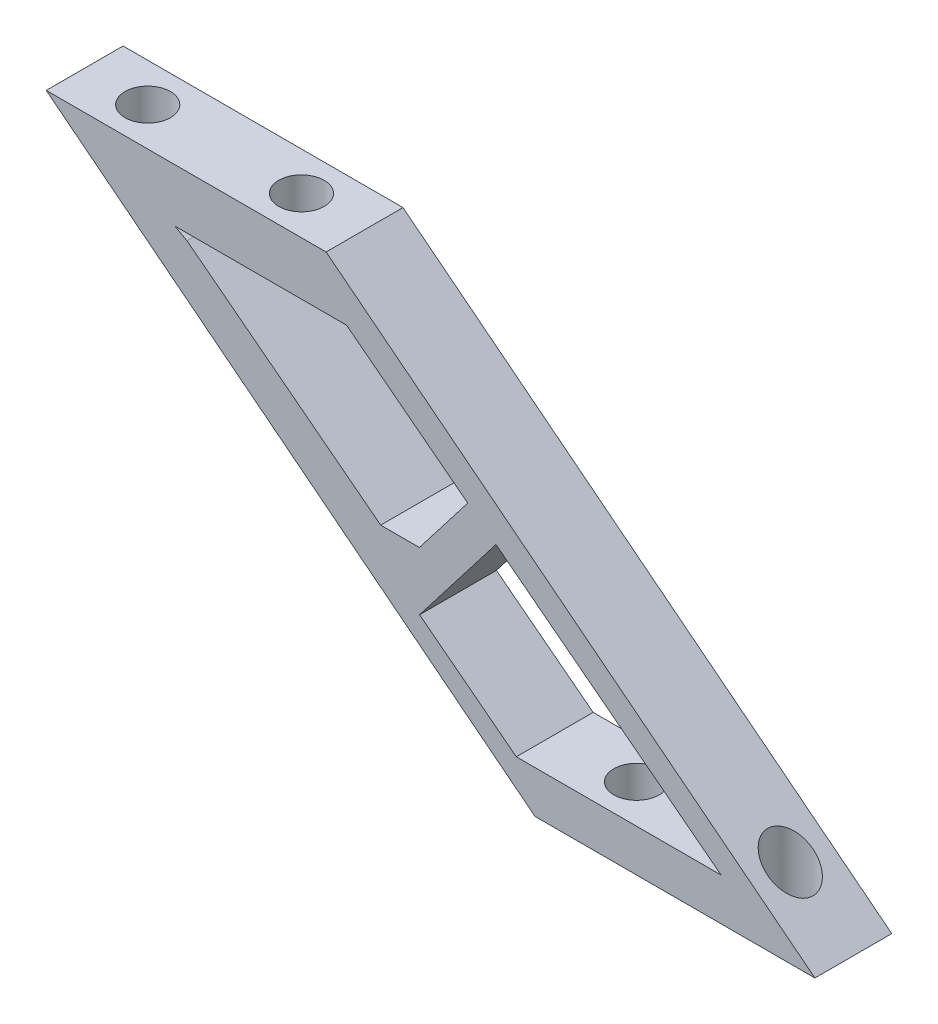
ISO-10303-21;
HEADER;
FILE_DESCRIPTION(('STEP AP214'),'2;1');
FILE_NAME('part.step','',(''),(''),'','','');
FILE_SCHEMA(('AUTOMOTIVE_DESIGN { 1 0 10303 214 1 1 1 1 }'));
ENDSEC;
DATA;
#1=APPLICATION_CONTEXT('core data for automotive mechanical design processes');
#2=APPLICATION_PROTOCOL_DEFINITION('international standard','automotive_design',2000,#1);
#3=PRODUCT_CONTEXT('',#1,'mechanical');
#4=PRODUCT('Part','Part','',(#3));
#5=PRODUCT_RELATED_PRODUCT_CATEGORY('part','',(#4));
#6=PRODUCT_DEFINITION_FORMATION('','',#4);
#7=PRODUCT_DEFINITION_CONTEXT('part definition',#1,'design');
#8=PRODUCT_DEFINITION('design','',#6,#7);
#9=PRODUCT_DEFINITION_SHAPE('','',#8);
#10=(LENGTH_UNIT() NAMED_UNIT(*) SI_UNIT(.MILLI.,.METRE.));
#11=(NAMED_UNIT(*) PLANE_ANGLE_UNIT() SI_UNIT($,.RADIAN.));
#12=(NAMED_UNIT(*) SI_UNIT($,.STERADIAN.) SOLID_ANGLE_UNIT());
#13=UNCERTAINTY_MEASURE_WITH_UNIT(LENGTH_MEASURE(1.E-05),#10,'distance_accuracy_value','');
#14=(GEOMETRIC_REPRESENTATION_CONTEXT(3) GLOBAL_UNCERTAINTY_ASSIGNED_CONTEXT((#13)) GLOBAL_UNIT_ASSIGNED_CONTEXT((#10,
#11,#12)) REPRESENTATION_CONTEXT('',''));
#15=CARTESIAN_POINT('',(0.,0.,0.));
#16=DIRECTION('',(0.,0.,1.));
#17=DIRECTION('',(1.,0.,0.));
#18=AXIS2_PLACEMENT_3D('',#15,#16,#17);
#19=CARTESIAN_POINT('',(0.,0.,5.08));
#20=DIRECTION('',(0.,0.,-1.));
#21=DIRECTION('',(-1.,0.,0.));
#22=AXIS2_PLACEMENT_3D('',#19,#20,#21);
#23=PLANE('',#22);
#24=DIRECTION('',(0.877534902704471,-0.479512767854469,0.));
#25=VECTOR('',#24,1.);
#26=CARTESIAN_POINT('',(-14.1614739616725,12.9484208044287,5.08));
#27=LINE('',#26,#25);
#28=CARTESIAN_POINT('',(-14.1614739616725,12.9484208044287,5.08));
#29=VERTEX_POINT('',#28);
#30=CARTESIAN_POINT('',(-13.3566851393728,12.5086587909408,5.08));
#31=VERTEX_POINT('',#30);
#32=EDGE_CURVE('E193',#29,#31,#27,.T.);
#33=ORIENTED_EDGE('',*,*,#32,.F.);
#34=DIRECTION('',(-1.,0.,0.));
#35=VECTOR('',#34,1.);
#36=CARTESIAN_POINT('',(-2.806028736932,12.9484208044287,5.08));
#37=LINE('',#36,#35);
#38=CARTESIAN_POINT('',(-2.806028736932,12.9484208044287,5.08));
#39=VERTEX_POINT('',#38);
#40=EDGE_CURVE('E210',#39,#29,#37,.T.);
#41=ORIENTED_EDGE('',*,*,#40,.F.);
#42=DIRECTION('',(-0.791782255563472,0.610803454291821,0.));
#43=VECTOR('',#42,1.);
#44=CARTESIAN_POINT('',(5.20104717489364,6.7715336724489,5.08));
#45=LINE('',#44,#43);
#46=CARTESIAN_POINT('',(5.20104717489364,6.7715336724489,5.08));
#47=VERTEX_POINT('',#46);
#48=EDGE_CURVE('E206',#47,#39,#45,.T.);
#49=ORIENTED_EDGE('',*,*,#48,.F.);
#50=DIRECTION('',(0.610803454291821,0.791782255563472,0.));
#51=VECTOR('',#50,1.);
#52=CARTESIAN_POINT('',(2.00746510452962,2.63170506271777,5.08));
#53=LINE('',#52,#51);
#54=CARTESIAN_POINT('',(2.00746510452962,2.63170506271777,5.08));
#55=VERTEX_POINT('',#54);
#56=EDGE_CURVE('E203',#55,#47,#53,.T.);
#57=ORIENTED_EDGE('',*,*,#56,.F.);
#58=DIRECTION('',(1.,0.,0.));
#59=VECTOR('',#58,1.);
#60=CARTESIAN_POINT('',(-0.553226602787449,2.63170506271777,5.08));
#61=LINE('',#60,#59);
#62=CARTESIAN_POINT('',(-0.553226602787449,2.63170506271777,5.08));
#63=VERTEX_POINT('',#62);
#64=EDGE_CURVE('E200',#63,#55,#61,.T.);
#65=ORIENTED_EDGE('',*,*,#64,.F.);
#66=DIRECTION('',(0.791782255563472,-0.610803454291821,0.));
#67=VECTOR('',#66,1.);
#68=CARTESIAN_POINT('',(-13.3566851393728,12.5086587909408,5.08));
#69=LINE('',#68,#67);
#70=EDGE_CURVE('E196',#31,#63,#69,.T.);
#71=ORIENTED_EDGE('',*,*,#70,.F.);
#72=EDGE_LOOP('',(#33,#41,#49,#57,#65,#71));
#73=FACE_BOUND('',#72,.T.);
#74=DIRECTION('',(0.786094086668964,-0.61810685718902,0.));
#75=VECTOR('',#74,1.);
#76=CARTESIAN_POINT('',(9.64668989547041,-8.93867595818816,5.08));
#77=LINE('',#76,#75);
#78=CARTESIAN_POINT('',(-22.6564459930313,16.4613240418118,5.08));
#79=VERTEX_POINT('',#78);
#80=CARTESIAN_POINT('',(9.64668989547041,-8.93867595818816,5.08));
#81=VERTEX_POINT('',#80);
#82=EDGE_CURVE('E256',#79,#81,#77,.T.);
#83=ORIENTED_EDGE('',*,*,#82,.T.);
#84=DIRECTION('',(1.,0.,0.));
#85=VECTOR('',#84,1.);
#86=CARTESIAN_POINT('',(28.1435540069687,-8.93867595818815,5.08));
#87=LINE('',#86,#85);
#88=CARTESIAN_POINT('',(28.1435540069687,-8.93867595818815,5.08));
#89=VERTEX_POINT('',#88);
#90=EDGE_CURVE('E260',#81,#89,#87,.T.);
#91=ORIENTED_EDGE('',*,*,#90,.T.);
#92=DIRECTION('',(-0.786094086668964,0.61810685718902,0.));
#93=VECTOR('',#92,1.);
#94=CARTESIAN_POINT('',(-4.15958188153309,16.4613240418118,5.08));
#95=LINE('',#94,#93);
#96=CARTESIAN_POINT('',(-4.15958188153309,16.4613240418118,5.08));
#97=VERTEX_POINT('',#96);
#98=EDGE_CURVE('E264',#89,#97,#95,.T.);
#99=ORIENTED_EDGE('',*,*,#98,.T.);
#100=DIRECTION('',(-1.,0.,0.));
#101=VECTOR('',#100,1.);
#102=CARTESIAN_POINT('',(-22.6564459930313,16.4613240418118,5.08));
#103=LINE('',#102,#101);
#104=EDGE_CURVE('E267',#97,#79,#103,.T.);
#105=ORIENTED_EDGE('',*,*,#104,.T.);
#106=EDGE_LOOP('',(#83,#91,#99,#105));
#107=FACE_BOUND('',#106,.T.);
#108=DIRECTION('',(1.,0.,0.));
#109=VECTOR('',#108,1.);
#110=CARTESIAN_POINT('',(8.40936408639423,-6.14480474340157,5.08));
#111=LINE('',#110,#109);
#112=CARTESIAN_POINT('',(8.40936408639423,-6.14480474340157,5.08));
#113=VERTEX_POINT('',#112);
#114=CARTESIAN_POINT('',(21.9444488250702,-6.14480474340157,5.08));
#115=VERTEX_POINT('',#114);
#116=EDGE_CURVE('E143',#113,#115,#111,.T.);
#117=ORIENTED_EDGE('',*,*,#116,.F.);
#118=DIRECTION('',(0.791782255563472,-0.610803454291821,0.));
#119=VECTOR('',#118,1.);
#120=CARTESIAN_POINT('',(2.01749969112943,-1.2139379241973,5.08));
#121=LINE('',#120,#119);
#122=CARTESIAN_POINT('',(2.01749969112943,-1.2139379241973,5.08));
#123=VERTEX_POINT('',#122);
#124=EDGE_CURVE('E169',#123,#113,#121,.T.);
#125=ORIENTED_EDGE('',*,*,#124,.F.);
#126=DIRECTION('',(-0.610803454291821,-0.791782255563472,0.));
#127=VECTOR('',#126,1.);
#128=CARTESIAN_POINT('',(7.06718074255971,5.33194492024936,5.08));
#129=LINE('',#128,#127);
#130=CARTESIAN_POINT('',(7.06718074255971,5.33194492024936,5.08));
#131=VERTEX_POINT('',#130);
#132=EDGE_CURVE('E165',#131,#123,#129,.T.);
#133=ORIENTED_EDGE('',*,*,#132,.F.);
#134=DIRECTION('',(-0.791782255563472,0.610803454291821,0.));
#135=VECTOR('',#134,1.);
#136=CARTESIAN_POINT('',(21.9444488250702,-6.14480474340157,5.08));
#137=LINE('',#136,#135);
#138=EDGE_CURVE('E152',#115,#131,#137,.T.);
#139=ORIENTED_EDGE('',*,*,#138,.F.);
#140=EDGE_LOOP('',(#117,#125,#133,#139));
#141=FACE_BOUND('',#140,.T.);
#142=ADVANCED_FACE('F39',(#73,#107,#141),#23,.F.);
#143=CARTESIAN_POINT('',(0.,0.,0.));
#144=DIRECTION('',(0.,0.,-1.));
#145=DIRECTION('',(-1.,0.,0.));
#146=AXIS2_PLACEMENT_3D('',#143,#144,#145);
#147=PLANE('',#146);
#148=DIRECTION('',(0.786094086668964,-0.61810685718902,0.));
#149=VECTOR('',#148,1.);
#150=CARTESIAN_POINT('',(9.64668989547041,-8.93867595818816,0.));
#151=LINE('',#150,#149);
#152=CARTESIAN_POINT('',(-22.6564459930313,16.4613240418118,0.));
#153=VERTEX_POINT('',#152);
#154=CARTESIAN_POINT('',(9.64668989547041,-8.93867595818816,0.));
#155=VERTEX_POINT('',#154);
#156=EDGE_CURVE('E255',#153,#155,#151,.T.);
#157=ORIENTED_EDGE('',*,*,#156,.F.);
#158=DIRECTION('',(-1.,0.,0.));
#159=VECTOR('',#158,1.);
#160=CARTESIAN_POINT('',(-22.6564459930313,16.4613240418118,0.));
#161=LINE('',#160,#159);
#162=CARTESIAN_POINT('',(-4.15958188153309,16.4613240418118,0.));
#163=VERTEX_POINT('',#162);
#164=EDGE_CURVE('E261',#163,#153,#161,.T.);
#165=ORIENTED_EDGE('',*,*,#164,.F.);
#166=DIRECTION('',(-0.786094086668964,0.61810685718902,0.));
#167=VECTOR('',#166,1.);
#168=CARTESIAN_POINT('',(-4.15958188153309,16.4613240418118,0.));
#169=LINE('',#168,#167);
#170=CARTESIAN_POINT('',(28.1435540069687,-8.93867595818815,0.));
#171=VERTEX_POINT('',#170);
#172=EDGE_CURVE('E277',#171,#163,#169,.T.);
#173=ORIENTED_EDGE('',*,*,#172,.F.);
#174=DIRECTION('',(1.,0.,0.));
#175=VECTOR('',#174,1.);
#176=CARTESIAN_POINT('',(28.1435540069687,-8.93867595818815,0.));
#177=LINE('',#176,#175);
#178=EDGE_CURVE('E274',#155,#171,#177,.T.);
#179=ORIENTED_EDGE('',*,*,#178,.F.);
#180=EDGE_LOOP('',(#157,#165,#173,#179));
#181=FACE_BOUND('',#180,.T.);
#182=DIRECTION('',(-1.,0.,0.));
#183=VECTOR('',#182,1.);
#184=CARTESIAN_POINT('',(-2.806028736932,12.9484208044287,0.));
#185=LINE('',#184,#183);
#186=CARTESIAN_POINT('',(-2.806028736932,12.9484208044287,0.));
#187=VERTEX_POINT('',#186);
#188=CARTESIAN_POINT('',(-14.1614739616725,12.9484208044287,0.));
#189=VERTEX_POINT('',#188);
#190=EDGE_CURVE('E197',#187,#189,#185,.T.);
#191=ORIENTED_EDGE('',*,*,#190,.T.);
#192=DIRECTION('',(0.877534902704471,-0.479512767854469,0.));
#193=VECTOR('',#192,1.);
#194=CARTESIAN_POINT('',(-14.1614739616725,12.9484208044287,0.));
#195=LINE('',#194,#193);
#196=CARTESIAN_POINT('',(-13.3566851393728,12.5086587909408,0.));
#197=VERTEX_POINT('',#196);
#198=EDGE_CURVE('E161',#189,#197,#195,.T.);
#199=ORIENTED_EDGE('',*,*,#198,.T.);
#200=DIRECTION('',(0.791782255563472,-0.610803454291821,0.));
#201=VECTOR('',#200,1.);
#202=CARTESIAN_POINT('',(-13.3566851393728,12.5086587909408,0.));
#203=LINE('',#202,#201);
#204=CARTESIAN_POINT('',(-0.553226602787449,2.63170506271777,0.));
#205=VERTEX_POINT('',#204);
#206=EDGE_CURVE('E217',#197,#205,#203,.T.);
#207=ORIENTED_EDGE('',*,*,#206,.T.);
#208=DIRECTION('',(1.,0.,0.));
#209=VECTOR('',#208,1.);
#210=CARTESIAN_POINT('',(-0.553226602787449,2.63170506271777,0.));
#211=LINE('',#210,#209);
#212=CARTESIAN_POINT('',(2.00746510452962,2.63170506271777,0.));
#213=VERTEX_POINT('',#212);
#214=EDGE_CURVE('E221',#205,#213,#211,.T.);
#215=ORIENTED_EDGE('',*,*,#214,.T.);
#216=DIRECTION('',(0.610803454291821,0.791782255563472,0.));
#217=VECTOR('',#216,1.);
#218=CARTESIAN_POINT('',(2.00746510452962,2.63170506271777,0.));
#219=LINE('',#218,#217);
#220=CARTESIAN_POINT('',(5.20104717489364,6.7715336724489,0.));
#221=VERTEX_POINT('',#220);
#222=EDGE_CURVE('E225',#213,#221,#219,.T.);
#223=ORIENTED_EDGE('',*,*,#222,.T.);
#224=DIRECTION('',(-0.791782255563472,0.610803454291821,0.));
#225=VECTOR('',#224,1.);
#226=CARTESIAN_POINT('',(5.20104717489364,6.7715336724489,0.));
#227=LINE('',#226,#225);
#228=EDGE_CURVE('E229',#221,#187,#227,.T.);
#229=ORIENTED_EDGE('',*,*,#228,.T.);
#230=EDGE_LOOP('',(#191,#199,#207,#215,#223,#229));
#231=FACE_BOUND('',#230,.T.);
#232=DIRECTION('',(0.791782255563472,-0.610803454291821,0.));
#233=VECTOR('',#232,1.);
#234=CARTESIAN_POINT('',(2.01749969112943,-1.2139379241973,0.));
#235=LINE('',#234,#233);
#236=CARTESIAN_POINT('',(2.01749969112943,-1.2139379241973,0.));
#237=VERTEX_POINT('',#236);
#238=CARTESIAN_POINT('',(8.40936408639423,-6.14480474340157,0.));
#239=VERTEX_POINT('',#238);
#240=EDGE_CURVE('E153',#237,#239,#235,.T.);
#241=ORIENTED_EDGE('',*,*,#240,.T.);
#242=DIRECTION('',(1.,0.,0.));
#243=VECTOR('',#242,1.);
#244=CARTESIAN_POINT('',(8.40936408639423,-6.14480474340157,0.));
#245=LINE('',#244,#243);
#246=CARTESIAN_POINT('',(21.9444488250702,-6.14480474340157,0.));
#247=VERTEX_POINT('',#246);
#248=EDGE_CURVE('E65',#239,#247,#245,.T.);
#249=ORIENTED_EDGE('',*,*,#248,.T.);
#250=DIRECTION('',(-0.791782255563472,0.610803454291821,0.));
#251=VECTOR('',#250,1.);
#252=CARTESIAN_POINT('',(21.9444488250702,-6.14480474340157,0.));
#253=LINE('',#252,#251);
#254=CARTESIAN_POINT('',(7.06718074255971,5.33194492024936,0.));
#255=VERTEX_POINT('',#254);
#256=EDGE_CURVE('E159',#247,#255,#253,.T.);
#257=ORIENTED_EDGE('',*,*,#256,.T.);
#258=DIRECTION('',(-0.610803454291821,-0.791782255563472,0.));
#259=VECTOR('',#258,1.);
#260=CARTESIAN_POINT('',(7.06718074255971,5.33194492024936,0.));
#261=LINE('',#260,#259);
#262=EDGE_CURVE('E180',#255,#237,#261,.T.);
#263=ORIENTED_EDGE('',*,*,#262,.T.);
#264=EDGE_LOOP('',(#241,#249,#257,#263));
#265=FACE_BOUND('',#264,.T.);
#266=ADVANCED_FACE('F342',(#181,#231,#265),#147,.T.);
#267=CARTESIAN_POINT('',(9.64668989547041,-8.93867595818816,5.08));
#268=DIRECTION('',(0.61810685718902,0.786094086668963,0.));
#269=DIRECTION('',(-0.786094086668964,0.61810685718902,0.));
#270=AXIS2_PLACEMENT_3D('',#267,#268,#269);
#271=PLANE('',#270);
#272=CARTESIAN_POINT('',(-18.4880139372822,13.1836802061954,2.54));
#273=DIRECTION('',(0.61810685718902,0.786094086668963,0.));
#274=DIRECTION('',(-0.786094086668964,0.61810685718902,0.));
#275=AXIS2_PLACEMENT_3D('',#272,#273,#274);
#276=ELLIPSE('',#275,1.90816853279762,1.5);
#277=CARTESIAN_POINT('',(-19.9880139372822,14.3631322609899,2.54));
#278=VERTEX_POINT('',#277);
#279=EDGE_CURVE('E177',#278,#278,#276,.T.);
#280=ORIENTED_EDGE('',*,*,#279,.T.);
#281=EDGE_LOOP('',(#280));
#282=FACE_BOUND('',#281,.T.);
#283=ORIENTED_EDGE('',*,*,#156,.T.);
#284=DIRECTION('',(0.,0.,-1.));
#285=VECTOR('',#284,1.);
#286=CARTESIAN_POINT('',(9.64668989547041,-8.93867595818816,5.08));
#287=LINE('',#286,#285);
#288=EDGE_CURVE('E11',#81,#155,#287,.T.);
#289=ORIENTED_EDGE('',*,*,#288,.F.);
#290=ORIENTED_EDGE('',*,*,#82,.F.);
#291=DIRECTION('',(0.,0.,-1.));
#292=VECTOR('',#291,1.);
#293=CARTESIAN_POINT('',(-22.6564459930313,16.4613240418118,5.08));
#294=LINE('',#293,#292);
#295=EDGE_CURVE('E270',#79,#153,#294,.T.);
#296=ORIENTED_EDGE('',*,*,#295,.T.);
#297=EDGE_LOOP('',(#283,#289,#290,#296));
#298=FACE_BOUND('',#297,.T.);
#299=ADVANCED_FACE('F41',(#282,#298),#271,.F.);
#300=CARTESIAN_POINT('',(28.1435540069687,-8.93867595818815,5.08));
#301=DIRECTION('',(0.,1.,0.));
#302=DIRECTION('',(-1.,0.,0.));
#303=AXIS2_PLACEMENT_3D('',#300,#301,#302);
#304=PLANE('',#303);
#305=CARTESIAN_POINT('',(23.9751219512195,-8.93867595818816,2.54));
#306=DIRECTION('',(0.,-1.,0.));
#307=DIRECTION('',(1.,0.,0.));
#308=AXIS2_PLACEMENT_3D('',#305,#306,#307);
#309=CIRCLE('',#308,1.5);
#310=CARTESIAN_POINT('',(25.4751219512195,-8.93867595818816,2.54));
#311=VERTEX_POINT('',#310);
#312=EDGE_CURVE('E299',#311,#311,#309,.T.);
#313=ORIENTED_EDGE('',*,*,#312,.F.);
#314=EDGE_LOOP('',(#313));
#315=FACE_BOUND('',#314,.T.);
#316=CARTESIAN_POINT('',(13.8151219512195,-8.93867595818816,2.54));
#317=DIRECTION('',(0.,-1.,0.));
#318=DIRECTION('',(1.,0.,0.));
#319=AXIS2_PLACEMENT_3D('',#316,#317,#318);
#320=CIRCLE('',#319,1.5);
#321=CARTESIAN_POINT('',(15.3151219512195,-8.93867595818816,2.54));
#322=VERTEX_POINT('',#321);
#323=EDGE_CURVE('E307',#322,#322,#320,.T.);
#324=ORIENTED_EDGE('',*,*,#323,.F.);
#325=EDGE_LOOP('',(#324));
#326=FACE_BOUND('',#325,.T.);
#327=ORIENTED_EDGE('',*,*,#178,.T.);
#328=DIRECTION('',(0.,0.,-1.));
#329=VECTOR('',#328,1.);
#330=CARTESIAN_POINT('',(28.1435540069687,-8.93867595818815,5.08));
#331=LINE('',#330,#329);
#332=EDGE_CURVE('E49',#89,#171,#331,.T.);
#333=ORIENTED_EDGE('',*,*,#332,.F.);
#334=ORIENTED_EDGE('',*,*,#90,.F.);
#335=ORIENTED_EDGE('',*,*,#288,.T.);
#336=EDGE_LOOP('',(#327,#333,#334,#335));
#337=FACE_BOUND('',#336,.T.);
#338=ADVANCED_FACE('F362',(#315,#326,#337),#304,.F.);
#339=CARTESIAN_POINT('',(-4.15958188153309,16.4613240418118,5.08));
#340=DIRECTION('',(-0.61810685718902,-0.786094086668963,0.));
#341=DIRECTION('',(0.786094086668963,-0.61810685718902,0.));
#342=AXIS2_PLACEMENT_3D('',#339,#340,#341);
#343=PLANE('',#342);
#344=CARTESIAN_POINT('',(23.9751219512195,-5.66103212257173,2.54));
#345=DIRECTION('',(-0.61810685718902,-0.786094086668963,0.));
#346=DIRECTION('',(0.786094086668963,-0.61810685718902,0.));
#347=AXIS2_PLACEMENT_3D('',#344,#345,#346);
#348=ELLIPSE('',#347,1.90816853279762,1.5);
#349=CARTESIAN_POINT('',(25.4751219512195,-6.84048417736625,2.54));
#350=VERTEX_POINT('',#349);
#351=EDGE_CURVE('E43',#350,#350,#348,.T.);
#352=ORIENTED_EDGE('',*,*,#351,.T.);
#353=EDGE_LOOP('',(#352));
#354=FACE_BOUND('',#353,.T.);
#355=ORIENTED_EDGE('',*,*,#172,.T.);
#356=DIRECTION('',(0.,0.,-1.));
#357=VECTOR('',#356,1.);
#358=CARTESIAN_POINT('',(-4.15958188153309,16.4613240418118,5.08));
#359=LINE('',#358,#357);
#360=EDGE_CURVE('E285',#97,#163,#359,.T.);
#361=ORIENTED_EDGE('',*,*,#360,.F.);
#362=ORIENTED_EDGE('',*,*,#98,.F.);
#363=ORIENTED_EDGE('',*,*,#332,.T.);
#364=EDGE_LOOP('',(#355,#361,#362,#363));
#365=FACE_BOUND('',#364,.T.);
#366=ADVANCED_FACE('F359',(#354,#365),#343,.F.);
#367=CARTESIAN_POINT('',(-22.6564459930313,16.4613240418118,5.08));
#368=DIRECTION('',(0.,-1.,0.));
#369=DIRECTION('',(0.,0.,-1.));
#370=AXIS2_PLACEMENT_3D('',#367,#368,#369);
#371=PLANE('',#370);
#372=CARTESIAN_POINT('',(-18.4880139372822,16.4613240418118,2.54));
#373=DIRECTION('',(0.,1.,0.));
#374=DIRECTION('',(0.,0.,1.));
#375=AXIS2_PLACEMENT_3D('',#372,#373,#374);
#376=CIRCLE('',#375,1.5);
#377=CARTESIAN_POINT('',(-18.4880139372822,16.4613240418118,4.04));
#378=VERTEX_POINT('',#377);
#379=EDGE_CURVE('E295',#378,#378,#376,.T.);
#380=ORIENTED_EDGE('',*,*,#379,.F.);
#381=EDGE_LOOP('',(#380));
#382=FACE_BOUND('',#381,.T.);
#383=CARTESIAN_POINT('',(-8.32801393728222,16.4613240418118,2.54));
#384=DIRECTION('',(0.,1.,0.));
#385=DIRECTION('',(0.,0.,1.));
#386=AXIS2_PLACEMENT_3D('',#383,#384,#385);
#387=CIRCLE('',#386,1.5);
#388=CARTESIAN_POINT('',(-8.32801393728222,16.4613240418118,4.04));
#389=VERTEX_POINT('',#388);
#390=EDGE_CURVE('E305',#389,#389,#387,.T.);
#391=ORIENTED_EDGE('',*,*,#390,.F.);
#392=EDGE_LOOP('',(#391));
#393=FACE_BOUND('',#392,.T.);
#394=ORIENTED_EDGE('',*,*,#164,.T.);
#395=ORIENTED_EDGE('',*,*,#295,.F.);
#396=ORIENTED_EDGE('',*,*,#104,.F.);
#397=ORIENTED_EDGE('',*,*,#360,.T.);
#398=EDGE_LOOP('',(#394,#395,#396,#397));
#399=FACE_BOUND('',#398,.T.);
#400=ADVANCED_FACE('F356',(#382,#393,#399),#371,.F.);
#401=CARTESIAN_POINT('',(-14.1614739616725,12.9484208044287,5.08));
#402=DIRECTION('',(0.479512767854469,0.877534902704471,0.));
#403=DIRECTION('',(-0.877534902704471,0.479512767854469,0.));
#404=AXIS2_PLACEMENT_3D('',#401,#402,#403);
#405=PLANE('',#404);
#406=ORIENTED_EDGE('',*,*,#198,.F.);
#407=DIRECTION('',(0.,0.,-1.));
#408=VECTOR('',#407,1.);
#409=CARTESIAN_POINT('',(-14.1614739616725,12.9484208044287,5.08));
#410=LINE('',#409,#408);
#411=EDGE_CURVE('E213',#29,#189,#410,.T.);
#412=ORIENTED_EDGE('',*,*,#411,.F.);
#413=ORIENTED_EDGE('',*,*,#32,.T.);
#414=DIRECTION('',(0.,0.,-1.));
#415=VECTOR('',#414,1.);
#416=CARTESIAN_POINT('',(-13.3566851393728,12.5086587909408,5.08));
#417=LINE('',#416,#415);
#418=EDGE_CURVE('E251',#31,#197,#417,.T.);
#419=ORIENTED_EDGE('',*,*,#418,.T.);
#420=EDGE_LOOP('',(#406,#412,#413,#419));
#421=FACE_BOUND('',#420,.T.);
#422=ADVANCED_FACE('F353',(#421),#405,.T.);
#423=CARTESIAN_POINT('',(-13.3566851393728,12.5086587909408,5.08));
#424=DIRECTION('',(0.610803454291821,0.791782255563472,0.));
#425=DIRECTION('',(-0.791782255563472,0.610803454291821,0.));
#426=AXIS2_PLACEMENT_3D('',#423,#424,#425);
#427=PLANE('',#426);
#428=ORIENTED_EDGE('',*,*,#206,.F.);
#429=ORIENTED_EDGE('',*,*,#418,.F.);
#430=ORIENTED_EDGE('',*,*,#70,.T.);
#431=DIRECTION('',(0.,0.,-1.));
#432=VECTOR('',#431,1.);
#433=CARTESIAN_POINT('',(-0.553226602787449,2.63170506271777,5.08));
#434=LINE('',#433,#432);
#435=EDGE_CURVE('E248',#63,#205,#434,.T.);
#436=ORIENTED_EDGE('',*,*,#435,.T.);
#437=EDGE_LOOP('',(#428,#429,#430,#436));
#438=FACE_BOUND('',#437,.T.);
#439=ADVANCED_FACE('F416',(#438),#427,.T.);
#440=CARTESIAN_POINT('',(-0.553226602787449,2.63170506271777,5.08));
#441=DIRECTION('',(0.,1.,0.));
#442=DIRECTION('',(0.,0.,1.));
#443=AXIS2_PLACEMENT_3D('',#440,#441,#442);
#444=PLANE('',#443);
#445=ORIENTED_EDGE('',*,*,#214,.F.);
#446=ORIENTED_EDGE('',*,*,#435,.F.);
#447=ORIENTED_EDGE('',*,*,#64,.T.);
#448=DIRECTION('',(0.,0.,-1.));
#449=VECTOR('',#448,1.);
#450=CARTESIAN_POINT('',(2.00746510452962,2.63170506271777,5.08));
#451=LINE('',#450,#449);
#452=EDGE_CURVE('E245',#55,#213,#451,.T.);
#453=ORIENTED_EDGE('',*,*,#452,.T.);
#454=EDGE_LOOP('',(#445,#446,#447,#453));
#455=FACE_BOUND('',#454,.T.);
#456=ADVANCED_FACE('F413',(#455),#444,.T.);
#457=CARTESIAN_POINT('',(2.00746510452962,2.63170506271777,5.08));
#458=DIRECTION('',(-0.791782255563472,0.610803454291821,0.));
#459=DIRECTION('',(-0.610803454291821,-0.791782255563472,0.));
#460=AXIS2_PLACEMENT_3D('',#457,#458,#459);
#461=PLANE('',#460);
#462=ORIENTED_EDGE('',*,*,#222,.F.);
#463=ORIENTED_EDGE('',*,*,#452,.F.);
#464=ORIENTED_EDGE('',*,*,#56,.T.);
#465=DIRECTION('',(0.,0.,-1.));
#466=VECTOR('',#465,1.);
#467=CARTESIAN_POINT('',(5.20104717489364,6.7715336724489,5.08));
#468=LINE('',#467,#466);
#469=EDGE_CURVE('E242',#47,#221,#468,.T.);
#470=ORIENTED_EDGE('',*,*,#469,.T.);
#471=EDGE_LOOP('',(#462,#463,#464,#470));
#472=FACE_BOUND('',#471,.T.);
#473=ADVANCED_FACE('F409',(#472),#461,.T.);
#474=CARTESIAN_POINT('',(5.20104717489364,6.7715336724489,5.08));
#475=DIRECTION('',(-0.610803454291821,-0.791782255563472,0.));
#476=DIRECTION('',(0.791782255563472,-0.610803454291821,0.));
#477=AXIS2_PLACEMENT_3D('',#474,#475,#476);
#478=PLANE('',#477);
#479=ORIENTED_EDGE('',*,*,#228,.F.);
#480=ORIENTED_EDGE('',*,*,#469,.F.);
#481=ORIENTED_EDGE('',*,*,#48,.T.);
#482=DIRECTION('',(0.,0.,-1.));
#483=VECTOR('',#482,1.);
#484=CARTESIAN_POINT('',(-2.806028736932,12.9484208044287,5.08));
#485=LINE('',#484,#483);
#486=EDGE_CURVE('E239',#39,#187,#485,.T.);
#487=ORIENTED_EDGE('',*,*,#486,.T.);
#488=EDGE_LOOP('',(#479,#480,#481,#487));
#489=FACE_BOUND('',#488,.T.);
#490=ADVANCED_FACE('F405',(#489),#478,.T.);
#491=CARTESIAN_POINT('',(-2.806028736932,12.9484208044287,5.08));
#492=DIRECTION('',(0.,-1.,0.));
#493=DIRECTION('',(0.,0.,-1.));
#494=AXIS2_PLACEMENT_3D('',#491,#492,#493);
#495=PLANE('',#494);
#496=CARTESIAN_POINT('',(-8.32801393728222,12.9484208044287,2.54));
#497=DIRECTION('',(0.,-1.,0.));
#498=DIRECTION('',(0.,0.,-1.));
#499=AXIS2_PLACEMENT_3D('',#496,#497,#498);
#500=CIRCLE('',#499,1.5);
#501=CARTESIAN_POINT('',(-8.32801393728222,12.9484208044287,1.04));
#502=VERTEX_POINT('',#501);
#503=EDGE_CURVE('E292',#502,#502,#500,.T.);
#504=ORIENTED_EDGE('',*,*,#503,.F.);
#505=EDGE_LOOP('',(#504));
#506=FACE_BOUND('',#505,.T.);
#507=ORIENTED_EDGE('',*,*,#190,.F.);
#508=ORIENTED_EDGE('',*,*,#486,.F.);
#509=ORIENTED_EDGE('',*,*,#40,.T.);
#510=ORIENTED_EDGE('',*,*,#411,.T.);
#511=EDGE_LOOP('',(#507,#508,#509,#510));
#512=FACE_BOUND('',#511,.T.);
#513=ADVANCED_FACE('F401',(#506,#512),#495,.T.);
#514=CARTESIAN_POINT('',(8.40936408639423,-6.14480474340157,5.08));
#515=DIRECTION('',(0.,1.,0.));
#516=DIRECTION('',(0.,0.,1.));
#517=AXIS2_PLACEMENT_3D('',#514,#515,#516);
#518=PLANE('',#517);
#519=CARTESIAN_POINT('',(13.8151219512195,-6.14480474340157,2.54));
#520=DIRECTION('',(0.,1.,0.));
#521=DIRECTION('',(0.,0.,1.));
#522=AXIS2_PLACEMENT_3D('',#519,#520,#521);
#523=CIRCLE('',#522,1.5);
#524=CARTESIAN_POINT('',(13.8151219512195,-6.14480474340157,4.04));
#525=VERTEX_POINT('',#524);
#526=EDGE_CURVE('E296',#525,#525,#523,.T.);
#527=ORIENTED_EDGE('',*,*,#526,.F.);
#528=EDGE_LOOP('',(#527));
#529=FACE_BOUND('',#528,.T.);
#530=ORIENTED_EDGE('',*,*,#248,.F.);
#531=DIRECTION('',(0.,0.,-1.));
#532=VECTOR('',#531,1.);
#533=CARTESIAN_POINT('',(8.40936408639423,-6.14480474340157,5.08));
#534=LINE('',#533,#532);
#535=EDGE_CURVE('E147',#113,#239,#534,.T.);
#536=ORIENTED_EDGE('',*,*,#535,.F.);
#537=ORIENTED_EDGE('',*,*,#116,.T.);
#538=DIRECTION('',(0.,0.,-1.));
#539=VECTOR('',#538,1.);
#540=CARTESIAN_POINT('',(21.9444488250702,-6.14480474340157,5.08));
#541=LINE('',#540,#539);
#542=EDGE_CURVE('E146',#115,#247,#541,.T.);
#543=ORIENTED_EDGE('',*,*,#542,.T.);
#544=EDGE_LOOP('',(#530,#536,#537,#543));
#545=FACE_BOUND('',#544,.T.);
#546=ADVANCED_FACE('F145',(#529,#545),#518,.T.);
#547=CARTESIAN_POINT('',(21.9444488250702,-6.14480474340157,5.08));
#548=DIRECTION('',(-0.610803454291821,-0.791782255563472,0.));
#549=DIRECTION('',(0.791782255563472,-0.610803454291821,0.));
#550=AXIS2_PLACEMENT_3D('',#547,#548,#549);
#551=PLANE('',#550);
#552=ORIENTED_EDGE('',*,*,#256,.F.);
#553=ORIENTED_EDGE('',*,*,#542,.F.);
#554=ORIENTED_EDGE('',*,*,#138,.T.);
#555=DIRECTION('',(0.,0.,-1.));
#556=VECTOR('',#555,1.);
#557=CARTESIAN_POINT('',(7.06718074255971,5.33194492024936,5.08));
#558=LINE('',#557,#556);
#559=EDGE_CURVE('E162',#131,#255,#558,.T.);
#560=ORIENTED_EDGE('',*,*,#559,.T.);
#561=EDGE_LOOP('',(#552,#553,#554,#560));
#562=FACE_BOUND('',#561,.T.);
#563=ADVANCED_FACE('F156',(#562),#551,.T.);
#564=CARTESIAN_POINT('',(7.06718074255971,5.33194492024936,5.08));
#565=DIRECTION('',(0.791782255563472,-0.610803454291821,0.));
#566=DIRECTION('',(0.610803454291821,0.791782255563472,0.));
#567=AXIS2_PLACEMENT_3D('',#564,#565,#566);
#568=PLANE('',#567);
#569=ORIENTED_EDGE('',*,*,#262,.F.);
#570=ORIENTED_EDGE('',*,*,#559,.F.);
#571=ORIENTED_EDGE('',*,*,#132,.T.);
#572=DIRECTION('',(0.,0.,-1.));
#573=VECTOR('',#572,1.);
#574=CARTESIAN_POINT('',(2.01749969112943,-1.2139379241973,5.08));
#575=LINE('',#574,#573);
#576=EDGE_CURVE('E57',#123,#237,#575,.T.);
#577=ORIENTED_EDGE('',*,*,#576,.T.);
#578=EDGE_LOOP('',(#569,#570,#571,#577));
#579=FACE_BOUND('',#578,.T.);
#580=ADVANCED_FACE('F389',(#579),#568,.T.);
#581=CARTESIAN_POINT('',(2.01749969112943,-1.2139379241973,5.08));
#582=DIRECTION('',(0.610803454291821,0.791782255563472,0.));
#583=DIRECTION('',(-0.791782255563472,0.610803454291821,0.));
#584=AXIS2_PLACEMENT_3D('',#581,#582,#583);
#585=PLANE('',#584);
#586=ORIENTED_EDGE('',*,*,#240,.F.);
#587=ORIENTED_EDGE('',*,*,#576,.F.);
#588=ORIENTED_EDGE('',*,*,#124,.T.);
#589=ORIENTED_EDGE('',*,*,#535,.T.);
#590=EDGE_LOOP('',(#586,#587,#588,#589));
#591=FACE_BOUND('',#590,.T.);
#592=ADVANCED_FACE('F338',(#591),#585,.T.);
#593=CARTESIAN_POINT('',(-8.32801393728222,11.3813240418118,2.54));
#594=DIRECTION('',(0.,1.,0.));
#595=DIRECTION('',(0.,0.,1.));
#596=AXIS2_PLACEMENT_3D('',#593,#594,#595);
#597=CYLINDRICAL_SURFACE('',#596,1.5);
#598=ORIENTED_EDGE('',*,*,#503,.T.);
#599=EDGE_LOOP('',(#598));
#600=FACE_BOUND('',#599,.T.);
#601=ORIENTED_EDGE('',*,*,#390,.T.);
#602=EDGE_LOOP('',(#601));
#603=FACE_BOUND('',#602,.T.);
#604=ADVANCED_FACE('F329',(#600,#603),#597,.F.);
#605=CARTESIAN_POINT('',(-18.4880139372822,11.3813240418118,2.54));
#606=DIRECTION('',(0.,1.,0.));
#607=DIRECTION('',(0.,0.,1.));
#608=AXIS2_PLACEMENT_3D('',#605,#606,#607);
#609=CYLINDRICAL_SURFACE('',#608,1.5);
#610=ORIENTED_EDGE('',*,*,#379,.T.);
#611=EDGE_LOOP('',(#610));
#612=FACE_BOUND('',#611,.T.);
#613=ORIENTED_EDGE('',*,*,#279,.F.);
#614=EDGE_LOOP('',(#613));
#615=FACE_BOUND('',#614,.T.);
#616=ADVANCED_FACE('F326',(#612,#615),#609,.F.);
#617=CARTESIAN_POINT('',(13.8151219512195,-2.33467595818816,2.54));
#618=DIRECTION('',(0.,-1.,0.));
#619=DIRECTION('',(1.,0.,0.));
#620=AXIS2_PLACEMENT_3D('',#617,#618,#619);
#621=CYLINDRICAL_SURFACE('',#620,1.5);
#622=ORIENTED_EDGE('',*,*,#526,.T.);
#623=EDGE_LOOP('',(#622));
#624=FACE_BOUND('',#623,.T.);
#625=ORIENTED_EDGE('',*,*,#323,.T.);
#626=EDGE_LOOP('',(#625));
#627=FACE_BOUND('',#626,.T.);
#628=ADVANCED_FACE('F328',(#624,#627),#621,.F.);
#629=CARTESIAN_POINT('',(23.9751219512195,-2.33467595818816,2.54));
#630=DIRECTION('',(0.,-1.,0.));
#631=DIRECTION('',(1.,0.,0.));
#632=AXIS2_PLACEMENT_3D('',#629,#630,#631);
#633=CYLINDRICAL_SURFACE('',#632,1.5);
#634=ORIENTED_EDGE('',*,*,#312,.T.);
#635=EDGE_LOOP('',(#634));
#636=FACE_BOUND('',#635,.T.);
#637=ORIENTED_EDGE('',*,*,#351,.F.);
#638=EDGE_LOOP('',(#637));
#639=FACE_BOUND('',#638,.T.);
#640=ADVANCED_FACE('F336',(#636,#639),#633,.F.);
#641=CLOSED_SHELL('',(#142,#266,#299,#338,#366,#400,#422,#439,#456,#473,#490,#513,#546,#563,
#580,#592,#604,#616,#628,#640));
#642=MANIFOLD_SOLID_BREP('B2',#641);
#643=ADVANCED_BREP_SHAPE_REPRESENTATION('',(#18,#642),#14);
#644=SHAPE_DEFINITION_REPRESENTATION(#9,#643);
ENDSEC;
END-ISO-10303-21;
